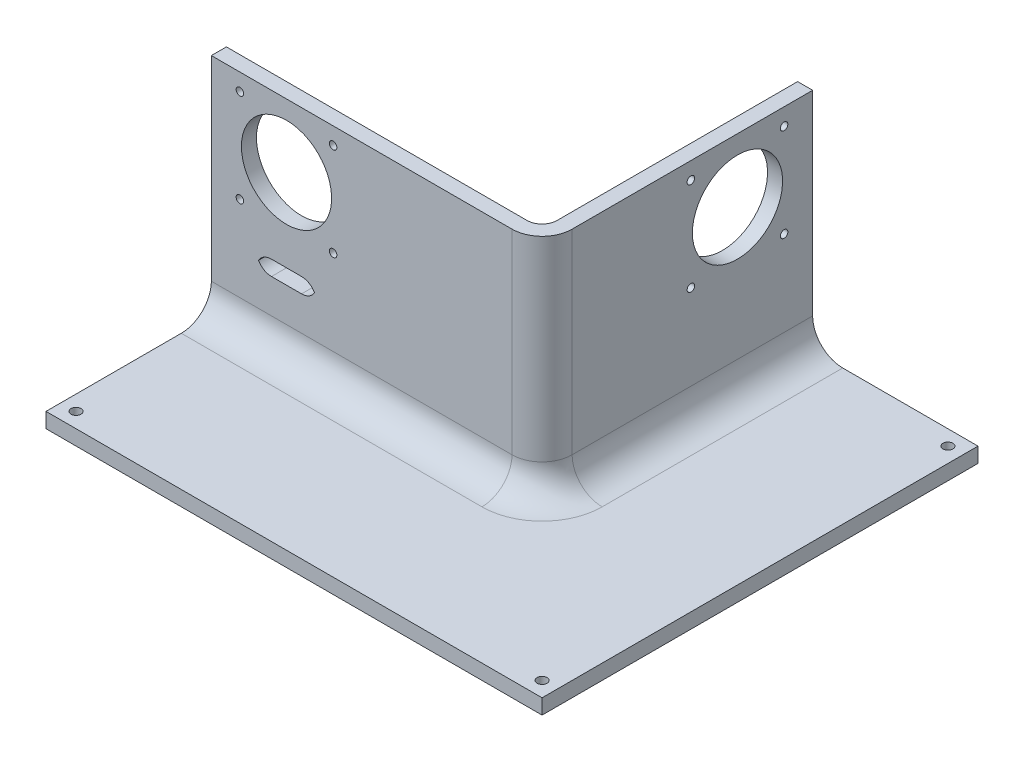
ISO-10303-21;
HEADER;
FILE_DESCRIPTION(('STEP AP214'),'2;1');
FILE_NAME('part.step','',(''),(''),'','','');
FILE_SCHEMA(('AUTOMOTIVE_DESIGN { 1 0 10303 214 1 1 1 1 }'));
ENDSEC;
DATA;
#1=APPLICATION_CONTEXT('core data for automotive mechanical design processes');
#2=APPLICATION_PROTOCOL_DEFINITION('international standard','automotive_design',2000,#1);
#3=PRODUCT_CONTEXT('',#1,'mechanical');
#4=PRODUCT('Part','Part','',(#3));
#5=PRODUCT_RELATED_PRODUCT_CATEGORY('part','',(#4));
#6=PRODUCT_DEFINITION_FORMATION('','',#4);
#7=PRODUCT_DEFINITION_CONTEXT('part definition',#1,'design');
#8=PRODUCT_DEFINITION('design','',#6,#7);
#9=PRODUCT_DEFINITION_SHAPE('','',#8);
#10=(LENGTH_UNIT() NAMED_UNIT(*) SI_UNIT(.MILLI.,.METRE.));
#11=(NAMED_UNIT(*) PLANE_ANGLE_UNIT() SI_UNIT($,.RADIAN.));
#12=(NAMED_UNIT(*) SI_UNIT($,.STERADIAN.) SOLID_ANGLE_UNIT());
#13=UNCERTAINTY_MEASURE_WITH_UNIT(LENGTH_MEASURE(1.E-05),#10,'distance_accuracy_value','');
#14=(GEOMETRIC_REPRESENTATION_CONTEXT(3) GLOBAL_UNCERTAINTY_ASSIGNED_CONTEXT((#13)) GLOBAL_UNIT_ASSIGNED_CONTEXT((#10,
#11,#12)) REPRESENTATION_CONTEXT('',''));
#15=CARTESIAN_POINT('',(0.,0.,0.));
#16=DIRECTION('',(0.,0.,1.));
#17=DIRECTION('',(1.,0.,0.));
#18=AXIS2_PLACEMENT_3D('',#15,#16,#17);
#19=CARTESIAN_POINT('',(0.,20.,-85.));
#20=DIRECTION('',(0.,0.,-1.));
#21=DIRECTION('',(-1.,0.,0.));
#22=AXIS2_PLACEMENT_3D('',#19,#20,#21);
#23=PLANE('',#22);
#24=DIRECTION('',(0.,1.,0.));
#25=VECTOR('',#24,1.);
#26=CARTESIAN_POINT('',(60.,-5.,-85.));
#27=LINE('',#26,#25);
#28=CARTESIAN_POINT('',(60.,0.,-85.));
#29=VERTEX_POINT('',#28);
#30=CARTESIAN_POINT('',(60.,5.,-85.));
#31=VERTEX_POINT('',#30);
#32=EDGE_CURVE('E76',#29,#31,#27,.T.);
#33=ORIENTED_EDGE('',*,*,#32,.F.);
#34=DIRECTION('',(1.,0.,0.));
#35=VECTOR('',#34,1.);
#36=CARTESIAN_POINT('',(0.,0.,-85.));
#37=LINE('',#36,#35);
#38=CARTESIAN_POINT('',(0.,0.,-85.));
#39=VERTEX_POINT('',#38);
#40=EDGE_CURVE('E280',#39,#29,#37,.T.);
#41=ORIENTED_EDGE('',*,*,#40,.F.);
#42=DIRECTION('',(0.,-1.,0.));
#43=VECTOR('',#42,1.);
#44=CARTESIAN_POINT('',(0.,20.,-85.));
#45=LINE('',#44,#43);
#46=CARTESIAN_POINT('',(0.,80.,-85.));
#47=VERTEX_POINT('',#46);
#48=EDGE_CURVE('E283',#47,#39,#45,.T.);
#49=ORIENTED_EDGE('',*,*,#48,.F.);
#50=DIRECTION('',(-1.,0.,0.));
#51=VECTOR('',#50,1.);
#52=CARTESIAN_POINT('',(0.,80.,-85.));
#53=LINE('',#52,#51);
#54=CARTESIAN_POINT('',(5.,80.,-85.));
#55=VERTEX_POINT('',#54);
#56=EDGE_CURVE('E263',#55,#47,#53,.T.);
#57=ORIENTED_EDGE('',*,*,#56,.F.);
#58=DIRECTION('',(0.,-1.,0.));
#59=VECTOR('',#58,1.);
#60=CARTESIAN_POINT('',(5.,80.,-85.));
#61=LINE('',#60,#59);
#62=CARTESIAN_POINT('',(5.,15.,-85.));
#63=VERTEX_POINT('',#62);
#64=EDGE_CURVE('E269',#55,#63,#61,.T.);
#65=ORIENTED_EDGE('',*,*,#64,.T.);
#66=CARTESIAN_POINT('',(15.,15.,-85.));
#67=DIRECTION('',(0.,0.,-1.));
#68=DIRECTION('',(-1.,0.,0.));
#69=AXIS2_PLACEMENT_3D('',#66,#67,#68);
#70=CIRCLE('',#69,10.);
#71=CARTESIAN_POINT('',(15.,5.,-85.));
#72=VERTEX_POINT('',#71);
#73=EDGE_CURVE('E336',#63,#72,#70,.F.);
#74=ORIENTED_EDGE('',*,*,#73,.T.);
#75=DIRECTION('',(-1.,0.,0.));
#76=VECTOR('',#75,1.);
#77=CARTESIAN_POINT('',(80.,5.,-85.));
#78=LINE('',#77,#76);
#79=EDGE_CURVE('E213',#31,#72,#78,.T.);
#80=ORIENTED_EDGE('',*,*,#79,.F.);
#81=EDGE_LOOP('',(#33,#41,#49,#57,#65,#74,#80));
#82=FACE_BOUND('',#81,.T.);
#83=ADVANCED_FACE('F59',(#82),#23,.T.);
#84=CARTESIAN_POINT('',(0.,0.,0.));
#85=DIRECTION('',(0.,1.,0.));
#86=DIRECTION('',(0.,0.,1.));
#87=AXIS2_PLACEMENT_3D('',#84,#85,#86);
#88=PLANE('',#87);
#89=CARTESIAN_POINT('',(55.,0.,-80.));
#90=DIRECTION('',(0.,1.,0.));
#91=DIRECTION('',(0.,0.,1.));
#92=AXIS2_PLACEMENT_3D('',#89,#90,#91);
#93=CIRCLE('',#92,1.65);
#94=CARTESIAN_POINT('',(55.,0.,-78.35));
#95=VERTEX_POINT('',#94);
#96=EDGE_CURVE('E232',#95,#95,#93,.T.);
#97=ORIENTED_EDGE('',*,*,#96,.T.);
#98=EDGE_LOOP('',(#97));
#99=FACE_BOUND('',#98,.T.);
#100=CARTESIAN_POINT('',(55.,0.,55.));
#101=DIRECTION('',(0.,1.,0.));
#102=DIRECTION('',(0.,0.,1.));
#103=AXIS2_PLACEMENT_3D('',#100,#101,#102);
#104=CIRCLE('',#103,1.65);
#105=CARTESIAN_POINT('',(55.,0.,56.65));
#106=VERTEX_POINT('',#105);
#107=EDGE_CURVE('E313',#106,#106,#104,.T.);
#108=ORIENTED_EDGE('',*,*,#107,.T.);
#109=EDGE_LOOP('',(#108));
#110=FACE_BOUND('',#109,.T.);
#111=CARTESIAN_POINT('',(-100.,0.,55.));
#112=DIRECTION('',(0.,1.,0.));
#113=DIRECTION('',(0.,0.,1.));
#114=AXIS2_PLACEMENT_3D('',#111,#112,#113);
#115=CIRCLE('',#114,1.65);
#116=CARTESIAN_POINT('',(-100.,0.,56.65));
#117=VERTEX_POINT('',#116);
#118=EDGE_CURVE('E228',#117,#117,#115,.T.);
#119=ORIENTED_EDGE('',*,*,#118,.T.);
#120=EDGE_LOOP('',(#119));
#121=FACE_BOUND('',#120,.T.);
#122=ORIENTED_EDGE('',*,*,#40,.T.);
#123=DIRECTION('',(0.,0.,1.));
#124=VECTOR('',#123,1.);
#125=CARTESIAN_POINT('',(60.,0.,0.));
#126=LINE('',#125,#124);
#127=CARTESIAN_POINT('',(60.,0.,60.));
#128=VERTEX_POINT('',#127);
#129=EDGE_CURVE('E204',#29,#128,#126,.T.);
#130=ORIENTED_EDGE('',*,*,#129,.T.);
#131=DIRECTION('',(-1.,0.,0.));
#132=VECTOR('',#131,1.);
#133=CARTESIAN_POINT('',(0.,0.,60.));
#134=LINE('',#133,#132);
#135=CARTESIAN_POINT('',(-105.,0.,60.));
#136=VERTEX_POINT('',#135);
#137=EDGE_CURVE('E203',#128,#136,#134,.T.);
#138=ORIENTED_EDGE('',*,*,#137,.T.);
#139=DIRECTION('',(0.,0.,-1.));
#140=VECTOR('',#139,1.);
#141=CARTESIAN_POINT('',(-105.,0.,0.));
#142=LINE('',#141,#140);
#143=CARTESIAN_POINT('',(-105.,0.,0.));
#144=VERTEX_POINT('',#143);
#145=EDGE_CURVE('E278',#136,#144,#142,.T.);
#146=ORIENTED_EDGE('',*,*,#145,.T.);
#147=DIRECTION('',(-1.,0.,0.));
#148=VECTOR('',#147,1.);
#149=CARTESIAN_POINT('',(0.,0.,0.));
#150=LINE('',#149,#148);
#151=CARTESIAN_POINT('',(-5.,0.,0.));
#152=VERTEX_POINT('',#151);
#153=EDGE_CURVE('E275',#152,#144,#150,.T.);
#154=ORIENTED_EDGE('',*,*,#153,.F.);
#155=CARTESIAN_POINT('',(-5.,0.,-5.));
#156=DIRECTION('',(0.,1.,0.));
#157=DIRECTION('',(0.,0.,1.));
#158=AXIS2_PLACEMENT_3D('',#155,#156,#157);
#159=CIRCLE('',#158,5.);
#160=CARTESIAN_POINT('',(0.,0.,-5.));
#161=VERTEX_POINT('',#160);
#162=EDGE_CURVE('E305',#152,#161,#159,.T.);
#163=ORIENTED_EDGE('',*,*,#162,.T.);
#164=DIRECTION('',(0.,0.,1.));
#165=VECTOR('',#164,1.);
#166=CARTESIAN_POINT('',(0.,0.,0.));
#167=LINE('',#166,#165);
#168=EDGE_CURVE('E272',#39,#161,#167,.T.);
#169=ORIENTED_EDGE('',*,*,#168,.F.);
#170=EDGE_LOOP('',(#122,#130,#138,#146,#154,#163,#169));
#171=FACE_BOUND('',#170,.T.);
#172=ADVANCED_FACE('F412',(#99,#110,#121,#171),#88,.F.);
#173=CARTESIAN_POINT('',(0.,20.,0.));
#174=DIRECTION('',(1.,0.,0.));
#175=DIRECTION('',(0.,0.,-1.));
#176=AXIS2_PLACEMENT_3D('',#173,#174,#175);
#177=PLANE('',#176);
#178=CARTESIAN_POINT('',(0.,74.35,-44.5));
#179=DIRECTION('',(-1.,0.,0.));
#180=DIRECTION('',(0.,0.,1.));
#181=AXIS2_PLACEMENT_3D('',#178,#179,#180);
#182=CIRCLE('',#181,1.25);
#183=CARTESIAN_POINT('',(0.,74.35,-43.25));
#184=VERTEX_POINT('',#183);
#185=EDGE_CURVE('E247',#184,#184,#182,.T.);
#186=ORIENTED_EDGE('',*,*,#185,.F.);
#187=EDGE_LOOP('',(#186));
#188=FACE_BOUND('',#187,.T.);
#189=CARTESIAN_POINT('',(0.,43.35,-75.5));
#190=DIRECTION('',(-1.,0.,0.));
#191=DIRECTION('',(0.,0.,1.));
#192=AXIS2_PLACEMENT_3D('',#189,#190,#191);
#193=CIRCLE('',#192,1.25);
#194=CARTESIAN_POINT('',(0.,43.35,-74.25));
#195=VERTEX_POINT('',#194);
#196=EDGE_CURVE('E246',#195,#195,#193,.T.);
#197=ORIENTED_EDGE('',*,*,#196,.F.);
#198=EDGE_LOOP('',(#197));
#199=FACE_BOUND('',#198,.T.);
#200=CARTESIAN_POINT('',(0.,43.35,-44.5));
#201=DIRECTION('',(-1.,0.,0.));
#202=DIRECTION('',(0.,0.,1.));
#203=AXIS2_PLACEMENT_3D('',#200,#201,#202);
#204=CIRCLE('',#203,1.25);
#205=CARTESIAN_POINT('',(0.,43.35,-43.25));
#206=VERTEX_POINT('',#205);
#207=EDGE_CURVE('E243',#206,#206,#204,.T.);
#208=ORIENTED_EDGE('',*,*,#207,.F.);
#209=EDGE_LOOP('',(#208));
#210=FACE_BOUND('',#209,.T.);
#211=CARTESIAN_POINT('',(0.,74.35,-75.5));
#212=DIRECTION('',(-1.,0.,0.));
#213=DIRECTION('',(0.,0.,1.));
#214=AXIS2_PLACEMENT_3D('',#211,#212,#213);
#215=CIRCLE('',#214,1.25);
#216=CARTESIAN_POINT('',(0.,74.35,-74.25));
#217=VERTEX_POINT('',#216);
#218=EDGE_CURVE('E250',#217,#217,#215,.T.);
#219=ORIENTED_EDGE('',*,*,#218,.F.);
#220=EDGE_LOOP('',(#219));
#221=FACE_BOUND('',#220,.T.);
#222=CARTESIAN_POINT('',(0.,58.85,-60.));
#223=DIRECTION('',(-1.,0.,0.));
#224=DIRECTION('',(0.,0.,1.));
#225=AXIS2_PLACEMENT_3D('',#222,#223,#224);
#226=CIRCLE('',#225,15.);
#227=CARTESIAN_POINT('',(0.,58.85,-45.));
#228=VERTEX_POINT('',#227);
#229=EDGE_CURVE('E256',#228,#228,#226,.T.);
#230=ORIENTED_EDGE('',*,*,#229,.F.);
#231=EDGE_LOOP('',(#230));
#232=FACE_BOUND('',#231,.T.);
#233=ORIENTED_EDGE('',*,*,#168,.T.);
#234=DIRECTION('',(0.,-1.,0.));
#235=VECTOR('',#234,1.);
#236=CARTESIAN_POINT('',(0.,80.,-5.));
#237=LINE('',#236,#235);
#238=CARTESIAN_POINT('',(0.,80.,-5.));
#239=VERTEX_POINT('',#238);
#240=EDGE_CURVE('E303',#161,#239,#237,.F.);
#241=ORIENTED_EDGE('',*,*,#240,.T.);
#242=DIRECTION('',(0.,0.,1.));
#243=VECTOR('',#242,1.);
#244=CARTESIAN_POINT('',(0.,80.,0.));
#245=LINE('',#244,#243);
#246=EDGE_CURVE('E266',#47,#239,#245,.T.);
#247=ORIENTED_EDGE('',*,*,#246,.F.);
#248=ORIENTED_EDGE('',*,*,#48,.T.);
#249=EDGE_LOOP('',(#233,#241,#247,#248));
#250=FACE_BOUND('',#249,.T.);
#251=ADVANCED_FACE('F418',(#188,#199,#210,#221,#232,#250),#177,.F.);
#252=CARTESIAN_POINT('',(0.,20.,0.));
#253=DIRECTION('',(0.,0.,1.));
#254=DIRECTION('',(1.,0.,0.));
#255=AXIS2_PLACEMENT_3D('',#252,#253,#254);
#256=PLANE('',#255);
#257=CARTESIAN_POINT('',(-95.5,43.35,0.));
#258=DIRECTION('',(0.,0.,-1.));
#259=DIRECTION('',(-1.,0.,0.));
#260=AXIS2_PLACEMENT_3D('',#257,#258,#259);
#261=CIRCLE('',#260,1.25);
#262=CARTESIAN_POINT('',(-96.75,43.35,0.));
#263=VERTEX_POINT('',#262);
#264=EDGE_CURVE('E495',#263,#263,#261,.T.);
#265=ORIENTED_EDGE('',*,*,#264,.F.);
#266=EDGE_LOOP('',(#265));
#267=FACE_BOUND('',#266,.T.);
#268=CARTESIAN_POINT('',(-64.5,43.35,0.));
#269=DIRECTION('',(0.,0.,-1.));
#270=DIRECTION('',(-1.,0.,0.));
#271=AXIS2_PLACEMENT_3D('',#268,#269,#270);
#272=CIRCLE('',#271,1.25);
#273=CARTESIAN_POINT('',(-65.75,43.35,0.));
#274=VERTEX_POINT('',#273);
#275=EDGE_CURVE('E497',#274,#274,#272,.T.);
#276=ORIENTED_EDGE('',*,*,#275,.F.);
#277=EDGE_LOOP('',(#276));
#278=FACE_BOUND('',#277,.T.);
#279=CARTESIAN_POINT('',(-64.5,74.35,0.));
#280=DIRECTION('',(0.,0.,-1.));
#281=DIRECTION('',(-1.,0.,0.));
#282=AXIS2_PLACEMENT_3D('',#279,#280,#281);
#283=CIRCLE('',#282,1.25);
#284=CARTESIAN_POINT('',(-65.75,74.35,0.));
#285=VERTEX_POINT('',#284);
#286=EDGE_CURVE('E500',#285,#285,#283,.T.);
#287=ORIENTED_EDGE('',*,*,#286,.F.);
#288=EDGE_LOOP('',(#287));
#289=FACE_BOUND('',#288,.T.);
#290=CARTESIAN_POINT('',(-95.5,74.35,0.));
#291=DIRECTION('',(0.,0.,-1.));
#292=DIRECTION('',(-1.,0.,0.));
#293=AXIS2_PLACEMENT_3D('',#290,#291,#292);
#294=CIRCLE('',#293,1.25);
#295=CARTESIAN_POINT('',(-96.75,74.35,0.));
#296=VERTEX_POINT('',#295);
#297=EDGE_CURVE('E494',#296,#296,#294,.T.);
#298=ORIENTED_EDGE('',*,*,#297,.F.);
#299=EDGE_LOOP('',(#298));
#300=FACE_BOUND('',#299,.T.);
#301=CARTESIAN_POINT('',(-80.,58.85,0.));
#302=DIRECTION('',(0.,0.,-1.));
#303=DIRECTION('',(-1.,0.,0.));
#304=AXIS2_PLACEMENT_3D('',#301,#302,#303);
#305=CIRCLE('',#304,15.);
#306=CARTESIAN_POINT('',(-95.,58.85,0.));
#307=VERTEX_POINT('',#306);
#308=EDGE_CURVE('E382',#307,#307,#305,.T.);
#309=ORIENTED_EDGE('',*,*,#308,.F.);
#310=EDGE_LOOP('',(#309));
#311=FACE_BOUND('',#310,.T.);
#312=DIRECTION('',(-1.,0.,0.));
#313=VECTOR('',#312,1.);
#314=CARTESIAN_POINT('',(0.,31.35,0.));
#315=LINE('',#314,#313);
#316=CARTESIAN_POINT('',(-75.,31.35,0.));
#317=VERTEX_POINT('',#316);
#318=CARTESIAN_POINT('',(-85.,31.35,0.));
#319=VERTEX_POINT('',#318);
#320=EDGE_CURVE('E480',#317,#319,#315,.T.);
#321=ORIENTED_EDGE('',*,*,#320,.T.);
#322=CARTESIAN_POINT('',(-85.,26.35,0.));
#323=DIRECTION('',(0.,0.,1.));
#324=DIRECTION('',(1.,0.,0.));
#325=AXIS2_PLACEMENT_3D('',#322,#323,#324);
#326=CIRCLE('',#325,5.);
#327=CARTESIAN_POINT('',(-89.3301270189222,28.85,0.));
#328=VERTEX_POINT('',#327);
#329=EDGE_CURVE('E364',#319,#328,#326,.T.);
#330=ORIENTED_EDGE('',*,*,#329,.T.);
#331=CARTESIAN_POINT('',(-85.,31.35,0.));
#332=DIRECTION('',(0.,0.,1.));
#333=DIRECTION('',(1.,0.,0.));
#334=AXIS2_PLACEMENT_3D('',#331,#332,#333);
#335=CIRCLE('',#334,5.);
#336=CARTESIAN_POINT('',(-85.,26.35,0.));
#337=VERTEX_POINT('',#336);
#338=EDGE_CURVE('E360',#328,#337,#335,.T.);
#339=ORIENTED_EDGE('',*,*,#338,.T.);
#340=DIRECTION('',(1.,0.,0.));
#341=VECTOR('',#340,1.);
#342=CARTESIAN_POINT('',(0.,26.35,0.));
#343=LINE('',#342,#341);
#344=CARTESIAN_POINT('',(-75.,26.35,0.));
#345=VERTEX_POINT('',#344);
#346=EDGE_CURVE('E344',#337,#345,#343,.T.);
#347=ORIENTED_EDGE('',*,*,#346,.T.);
#348=CARTESIAN_POINT('',(-75.,31.35,0.));
#349=DIRECTION('',(0.,0.,1.));
#350=DIRECTION('',(1.,0.,0.));
#351=AXIS2_PLACEMENT_3D('',#348,#349,#350);
#352=CIRCLE('',#351,5.);
#353=CARTESIAN_POINT('',(-70.6698729810778,28.85,0.));
#354=VERTEX_POINT('',#353);
#355=EDGE_CURVE('E12',#345,#354,#352,.T.);
#356=ORIENTED_EDGE('',*,*,#355,.T.);
#357=CARTESIAN_POINT('',(-75.,26.35,0.));
#358=DIRECTION('',(0.,0.,1.));
#359=DIRECTION('',(1.,0.,0.));
#360=AXIS2_PLACEMENT_3D('',#357,#358,#359);
#361=CIRCLE('',#360,5.);
#362=EDGE_CURVE('E368',#354,#317,#361,.T.);
#363=ORIENTED_EDGE('',*,*,#362,.T.);
#364=EDGE_LOOP('',(#321,#330,#339,#347,#356,#363));
#365=FACE_BOUND('',#364,.T.);
#366=DIRECTION('',(-1.,0.,0.));
#367=VECTOR('',#366,1.);
#368=CARTESIAN_POINT('',(-105.,80.,0.));
#369=LINE('',#368,#367);
#370=CARTESIAN_POINT('',(-5.,80.,0.));
#371=VERTEX_POINT('',#370);
#372=CARTESIAN_POINT('',(-105.,80.,0.));
#373=VERTEX_POINT('',#372);
#374=EDGE_CURVE('E238',#371,#373,#369,.T.);
#375=ORIENTED_EDGE('',*,*,#374,.F.);
#376=DIRECTION('',(0.,-1.,0.));
#377=VECTOR('',#376,1.);
#378=CARTESIAN_POINT('',(-5.,0.,0.));
#379=LINE('',#378,#377);
#380=EDGE_CURVE('E288',#371,#152,#379,.T.);
#381=ORIENTED_EDGE('',*,*,#380,.T.);
#382=ORIENTED_EDGE('',*,*,#153,.T.);
#383=DIRECTION('',(0.,-1.,0.));
#384=VECTOR('',#383,1.);
#385=CARTESIAN_POINT('',(-105.,20.,0.));
#386=LINE('',#385,#384);
#387=EDGE_CURVE('E285',#373,#144,#386,.T.);
#388=ORIENTED_EDGE('',*,*,#387,.F.);
#389=EDGE_LOOP('',(#375,#381,#382,#388));
#390=FACE_BOUND('',#389,.T.);
#391=ADVANCED_FACE('F427',(#267,#278,#289,#300,#311,#365,#390),#256,.F.);
#392=CARTESIAN_POINT('',(-105.,20.,0.));
#393=DIRECTION('',(-1.,0.,0.));
#394=DIRECTION('',(0.,0.,1.));
#395=AXIS2_PLACEMENT_3D('',#392,#393,#394);
#396=PLANE('',#395);
#397=DIRECTION('',(0.,0.,1.));
#398=VECTOR('',#397,1.);
#399=CARTESIAN_POINT('',(-105.,5.,5.00000000000003));
#400=LINE('',#399,#398);
#401=CARTESIAN_POINT('',(-105.,5.,15.));
#402=VERTEX_POINT('',#401);
#403=CARTESIAN_POINT('',(-105.,5.,60.));
#404=VERTEX_POINT('',#403);
#405=EDGE_CURVE('E210',#402,#404,#400,.T.);
#406=ORIENTED_EDGE('',*,*,#405,.F.);
#407=CARTESIAN_POINT('',(-105.,15.,15.));
#408=DIRECTION('',(-1.,0.,0.));
#409=DIRECTION('',(0.,0.,1.));
#410=AXIS2_PLACEMENT_3D('',#407,#408,#409);
#411=CIRCLE('',#410,10.);
#412=CARTESIAN_POINT('',(-105.,15.,5.00000000000001));
#413=VERTEX_POINT('',#412);
#414=EDGE_CURVE('E334',#402,#413,#411,.F.);
#415=ORIENTED_EDGE('',*,*,#414,.T.);
#416=DIRECTION('',(0.,-1.,0.));
#417=VECTOR('',#416,1.);
#418=CARTESIAN_POINT('',(-105.,80.,5.00000000000001));
#419=LINE('',#418,#417);
#420=CARTESIAN_POINT('',(-105.,80.,5.00000000000001));
#421=VERTEX_POINT('',#420);
#422=EDGE_CURVE('E240',#421,#413,#419,.T.);
#423=ORIENTED_EDGE('',*,*,#422,.F.);
#424=DIRECTION('',(0.,0.,1.));
#425=VECTOR('',#424,1.);
#426=CARTESIAN_POINT('',(-105.,80.,0.));
#427=LINE('',#426,#425);
#428=EDGE_CURVE('E231',#373,#421,#427,.T.);
#429=ORIENTED_EDGE('',*,*,#428,.F.);
#430=ORIENTED_EDGE('',*,*,#387,.T.);
#431=ORIENTED_EDGE('',*,*,#145,.F.);
#432=DIRECTION('',(0.,1.,0.));
#433=VECTOR('',#432,1.);
#434=CARTESIAN_POINT('',(-105.,-80.,60.));
#435=LINE('',#434,#433);
#436=EDGE_CURVE('E229',#136,#404,#435,.T.);
#437=ORIENTED_EDGE('',*,*,#436,.T.);
#438=EDGE_LOOP('',(#406,#415,#423,#429,#430,#431,#437));
#439=FACE_BOUND('',#438,.T.);
#440=ADVANCED_FACE('F423',(#439),#396,.T.);
#441=CARTESIAN_POINT('',(5.,80.,0.));
#442=DIRECTION('',(-1.,0.,0.));
#443=DIRECTION('',(0.,0.,1.));
#444=AXIS2_PLACEMENT_3D('',#441,#442,#443);
#445=PLANE('',#444);
#446=CARTESIAN_POINT('',(5.,74.35,-44.5));
#447=DIRECTION('',(-1.,0.,0.));
#448=DIRECTION('',(0.,0.,1.));
#449=AXIS2_PLACEMENT_3D('',#446,#447,#448);
#450=CIRCLE('',#449,1.25);
#451=CARTESIAN_POINT('',(5.,74.35,-43.25));
#452=VERTEX_POINT('',#451);
#453=EDGE_CURVE('E260',#452,#452,#450,.T.);
#454=ORIENTED_EDGE('',*,*,#453,.T.);
#455=EDGE_LOOP('',(#454));
#456=FACE_BOUND('',#455,.T.);
#457=CARTESIAN_POINT('',(5.,43.35,-75.5));
#458=DIRECTION('',(-1.,0.,0.));
#459=DIRECTION('',(0.,0.,1.));
#460=AXIS2_PLACEMENT_3D('',#457,#458,#459);
#461=CIRCLE('',#460,1.25);
#462=CARTESIAN_POINT('',(5.,43.35,-74.25));
#463=VERTEX_POINT('',#462);
#464=EDGE_CURVE('E296',#463,#463,#461,.T.);
#465=ORIENTED_EDGE('',*,*,#464,.T.);
#466=EDGE_LOOP('',(#465));
#467=FACE_BOUND('',#466,.T.);
#468=CARTESIAN_POINT('',(5.,43.35,-44.5));
#469=DIRECTION('',(-1.,0.,0.));
#470=DIRECTION('',(0.,0.,1.));
#471=AXIS2_PLACEMENT_3D('',#468,#469,#470);
#472=CIRCLE('',#471,1.25);
#473=CARTESIAN_POINT('',(5.,43.35,-43.25));
#474=VERTEX_POINT('',#473);
#475=EDGE_CURVE('E293',#474,#474,#472,.T.);
#476=ORIENTED_EDGE('',*,*,#475,.T.);
#477=EDGE_LOOP('',(#476));
#478=FACE_BOUND('',#477,.T.);
#479=CARTESIAN_POINT('',(5.,74.35,-75.5));
#480=DIRECTION('',(-1.,0.,0.));
#481=DIRECTION('',(0.,0.,1.));
#482=AXIS2_PLACEMENT_3D('',#479,#480,#481);
#483=CIRCLE('',#482,1.25);
#484=CARTESIAN_POINT('',(5.,74.35,-74.25));
#485=VERTEX_POINT('',#484);
#486=EDGE_CURVE('E255',#485,#485,#483,.T.);
#487=ORIENTED_EDGE('',*,*,#486,.T.);
#488=EDGE_LOOP('',(#487));
#489=FACE_BOUND('',#488,.T.);
#490=CARTESIAN_POINT('',(5.,58.85,-60.));
#491=DIRECTION('',(-1.,0.,0.));
#492=DIRECTION('',(0.,0.,1.));
#493=AXIS2_PLACEMENT_3D('',#490,#491,#492);
#494=CIRCLE('',#493,15.);
#495=CARTESIAN_POINT('',(5.,58.85,-45.));
#496=VERTEX_POINT('',#495);
#497=EDGE_CURVE('E259',#496,#496,#494,.T.);
#498=ORIENTED_EDGE('',*,*,#497,.T.);
#499=EDGE_LOOP('',(#498));
#500=FACE_BOUND('',#499,.T.);
#501=DIRECTION('',(0.,-1.,0.));
#502=VECTOR('',#501,1.);
#503=CARTESIAN_POINT('',(5.,80.,-4.99999999999999));
#504=LINE('',#503,#502);
#505=CARTESIAN_POINT('',(5.,80.,-4.99999999999999));
#506=VERTEX_POINT('',#505);
#507=CARTESIAN_POINT('',(5.,15.,-4.99999999999999));
#508=VERTEX_POINT('',#507);
#509=EDGE_CURVE('E328',#506,#508,#504,.T.);
#510=ORIENTED_EDGE('',*,*,#509,.T.);
#511=DIRECTION('',(0.,0.,-1.));
#512=VECTOR('',#511,1.);
#513=CARTESIAN_POINT('',(5.,15.,-85.));
#514=LINE('',#513,#512);
#515=EDGE_CURVE('E330',#508,#63,#514,.T.);
#516=ORIENTED_EDGE('',*,*,#515,.T.);
#517=ORIENTED_EDGE('',*,*,#64,.F.);
#518=DIRECTION('',(0.,0.,-1.));
#519=VECTOR('',#518,1.);
#520=CARTESIAN_POINT('',(5.,80.,0.));
#521=LINE('',#520,#519);
#522=EDGE_CURVE('E261',#506,#55,#521,.T.);
#523=ORIENTED_EDGE('',*,*,#522,.F.);
#524=EDGE_LOOP('',(#510,#516,#517,#523));
#525=FACE_BOUND('',#524,.T.);
#526=ADVANCED_FACE('F426',(#456,#467,#478,#489,#500,#525),#445,.F.);
#527=CARTESIAN_POINT('',(0.,80.,0.));
#528=DIRECTION('',(0.,-1.,0.));
#529=DIRECTION('',(0.,0.,-1.));
#530=AXIS2_PLACEMENT_3D('',#527,#528,#529);
#531=PLANE('',#530);
#532=DIRECTION('',(1.,0.,0.));
#533=VECTOR('',#532,1.);
#534=CARTESIAN_POINT('',(-105.,80.,5.00000000000001));
#535=LINE('',#534,#533);
#536=CARTESIAN_POINT('',(-5.,80.,5.00000000000001));
#537=VERTEX_POINT('',#536);
#538=EDGE_CURVE('E235',#421,#537,#535,.T.);
#539=ORIENTED_EDGE('',*,*,#538,.T.);
#540=CARTESIAN_POINT('',(-5.,80.,-4.99999999999999));
#541=DIRECTION('',(0.,-1.,0.));
#542=DIRECTION('',(0.,0.,-1.));
#543=AXIS2_PLACEMENT_3D('',#540,#541,#542);
#544=CIRCLE('',#543,10.);
#545=EDGE_CURVE('E332',#537,#506,#544,.F.);
#546=ORIENTED_EDGE('',*,*,#545,.T.);
#547=ORIENTED_EDGE('',*,*,#522,.T.);
#548=ORIENTED_EDGE('',*,*,#56,.T.);
#549=ORIENTED_EDGE('',*,*,#246,.T.);
#550=CARTESIAN_POINT('',(-5.,80.,-5.));
#551=DIRECTION('',(0.,-1.,0.));
#552=DIRECTION('',(0.,0.,-1.));
#553=AXIS2_PLACEMENT_3D('',#550,#551,#552);
#554=CIRCLE('',#553,5.);
#555=EDGE_CURVE('E307',#239,#371,#554,.T.);
#556=ORIENTED_EDGE('',*,*,#555,.T.);
#557=ORIENTED_EDGE('',*,*,#374,.T.);
#558=ORIENTED_EDGE('',*,*,#428,.T.);
#559=EDGE_LOOP('',(#539,#546,#547,#548,#549,#556,#557,#558));
#560=FACE_BOUND('',#559,.T.);
#561=ADVANCED_FACE('F531',(#560),#531,.F.);
#562=CARTESIAN_POINT('',(100.,58.85,-60.));
#563=DIRECTION('',(-1.,0.,0.));
#564=DIRECTION('',(0.,0.,1.));
#565=AXIS2_PLACEMENT_3D('',#562,#563,#564);
#566=CYLINDRICAL_SURFACE('',#565,15.);
#567=ORIENTED_EDGE('',*,*,#229,.T.);
#568=EDGE_LOOP('',(#567));
#569=FACE_BOUND('',#568,.T.);
#570=ORIENTED_EDGE('',*,*,#497,.F.);
#571=EDGE_LOOP('',(#570));
#572=FACE_BOUND('',#571,.T.);
#573=ADVANCED_FACE('F560',(#569,#572),#566,.F.);
#574=CARTESIAN_POINT('',(100.,74.35,-75.5));
#575=DIRECTION('',(-1.,0.,0.));
#576=DIRECTION('',(0.,0.,1.));
#577=AXIS2_PLACEMENT_3D('',#574,#575,#576);
#578=CYLINDRICAL_SURFACE('',#577,1.25);
#579=ORIENTED_EDGE('',*,*,#218,.T.);
#580=EDGE_LOOP('',(#579));
#581=FACE_BOUND('',#580,.T.);
#582=ORIENTED_EDGE('',*,*,#486,.F.);
#583=EDGE_LOOP('',(#582));
#584=FACE_BOUND('',#583,.T.);
#585=ADVANCED_FACE('F552',(#581,#584),#578,.F.);
#586=CARTESIAN_POINT('',(100.,43.35,-44.5));
#587=DIRECTION('',(-1.,0.,0.));
#588=DIRECTION('',(0.,0.,1.));
#589=AXIS2_PLACEMENT_3D('',#586,#587,#588);
#590=CYLINDRICAL_SURFACE('',#589,1.25);
#591=ORIENTED_EDGE('',*,*,#207,.T.);
#592=EDGE_LOOP('',(#591));
#593=FACE_BOUND('',#592,.T.);
#594=ORIENTED_EDGE('',*,*,#475,.F.);
#595=EDGE_LOOP('',(#594));
#596=FACE_BOUND('',#595,.T.);
#597=ADVANCED_FACE('F550',(#593,#596),#590,.F.);
#598=CARTESIAN_POINT('',(100.,43.35,-75.5));
#599=DIRECTION('',(-1.,0.,0.));
#600=DIRECTION('',(0.,0.,1.));
#601=AXIS2_PLACEMENT_3D('',#598,#599,#600);
#602=CYLINDRICAL_SURFACE('',#601,1.25);
#603=ORIENTED_EDGE('',*,*,#196,.T.);
#604=EDGE_LOOP('',(#603));
#605=FACE_BOUND('',#604,.T.);
#606=ORIENTED_EDGE('',*,*,#464,.F.);
#607=EDGE_LOOP('',(#606));
#608=FACE_BOUND('',#607,.T.);
#609=ADVANCED_FACE('F544',(#605,#608),#602,.F.);
#610=CARTESIAN_POINT('',(100.,74.35,-44.5));
#611=DIRECTION('',(-1.,0.,0.));
#612=DIRECTION('',(0.,0.,1.));
#613=AXIS2_PLACEMENT_3D('',#610,#611,#612);
#614=CYLINDRICAL_SURFACE('',#613,1.25);
#615=ORIENTED_EDGE('',*,*,#185,.T.);
#616=EDGE_LOOP('',(#615));
#617=FACE_BOUND('',#616,.T.);
#618=ORIENTED_EDGE('',*,*,#453,.F.);
#619=EDGE_LOOP('',(#618));
#620=FACE_BOUND('',#619,.T.);
#621=ADVANCED_FACE('F539',(#617,#620),#614,.F.);
#622=CARTESIAN_POINT('',(-105.,80.,5.00000000000001));
#623=DIRECTION('',(0.,0.,-1.));
#624=DIRECTION('',(-1.,0.,0.));
#625=AXIS2_PLACEMENT_3D('',#622,#623,#624);
#626=PLANE('',#625);
#627=CARTESIAN_POINT('',(-95.5,43.35,5.00000000000001));
#628=DIRECTION('',(0.,0.,-1.));
#629=DIRECTION('',(-1.,0.,0.));
#630=AXIS2_PLACEMENT_3D('',#627,#628,#629);
#631=CIRCLE('',#630,1.25);
#632=CARTESIAN_POINT('',(-96.75,43.35,5.00000000000001));
#633=VERTEX_POINT('',#632);
#634=EDGE_CURVE('E63',#633,#633,#631,.T.);
#635=ORIENTED_EDGE('',*,*,#634,.T.);
#636=EDGE_LOOP('',(#635));
#637=FACE_BOUND('',#636,.T.);
#638=CARTESIAN_POINT('',(-64.5,43.35,5.00000000000001));
#639=DIRECTION('',(0.,0.,-1.));
#640=DIRECTION('',(-1.,0.,0.));
#641=AXIS2_PLACEMENT_3D('',#638,#639,#640);
#642=CIRCLE('',#641,1.25);
#643=CARTESIAN_POINT('',(-65.75,43.35,5.00000000000001));
#644=VERTEX_POINT('',#643);
#645=EDGE_CURVE('E387',#644,#644,#642,.T.);
#646=ORIENTED_EDGE('',*,*,#645,.T.);
#647=EDGE_LOOP('',(#646));
#648=FACE_BOUND('',#647,.T.);
#649=CARTESIAN_POINT('',(-64.5,74.35,5.00000000000001));
#650=DIRECTION('',(0.,0.,-1.));
#651=DIRECTION('',(-1.,0.,0.));
#652=AXIS2_PLACEMENT_3D('',#649,#650,#651);
#653=CIRCLE('',#652,1.25);
#654=CARTESIAN_POINT('',(-65.75,74.35,5.00000000000001));
#655=VERTEX_POINT('',#654);
#656=EDGE_CURVE('E385',#655,#655,#653,.T.);
#657=ORIENTED_EDGE('',*,*,#656,.T.);
#658=EDGE_LOOP('',(#657));
#659=FACE_BOUND('',#658,.T.);
#660=CARTESIAN_POINT('',(-95.5,74.35,5.00000000000001));
#661=DIRECTION('',(0.,0.,-1.));
#662=DIRECTION('',(-1.,0.,0.));
#663=AXIS2_PLACEMENT_3D('',#660,#661,#662);
#664=CIRCLE('',#663,1.25);
#665=CARTESIAN_POINT('',(-96.75,74.35,5.00000000000001));
#666=VERTEX_POINT('',#665);
#667=EDGE_CURVE('E381',#666,#666,#664,.T.);
#668=ORIENTED_EDGE('',*,*,#667,.T.);
#669=EDGE_LOOP('',(#668));
#670=FACE_BOUND('',#669,.T.);
#671=CARTESIAN_POINT('',(-80.,58.85,5.00000000000001));
#672=DIRECTION('',(0.,0.,-1.));
#673=DIRECTION('',(-1.,0.,0.));
#674=AXIS2_PLACEMENT_3D('',#671,#672,#673);
#675=CIRCLE('',#674,15.);
#676=CARTESIAN_POINT('',(-95.,58.85,5.00000000000001));
#677=VERTEX_POINT('',#676);
#678=EDGE_CURVE('E378',#677,#677,#675,.T.);
#679=ORIENTED_EDGE('',*,*,#678,.T.);
#680=EDGE_LOOP('',(#679));
#681=FACE_BOUND('',#680,.T.);
#682=CARTESIAN_POINT('',(-75.,26.35,5.00000000000001));
#683=DIRECTION('',(0.,0.,-1.));
#684=DIRECTION('',(-1.,0.,0.));
#685=AXIS2_PLACEMENT_3D('',#682,#683,#684);
#686=CIRCLE('',#685,5.);
#687=CARTESIAN_POINT('',(-75.,31.35,5.00000000000001));
#688=VERTEX_POINT('',#687);
#689=CARTESIAN_POINT('',(-70.6698729810778,28.85,5.00000000000001));
#690=VERTEX_POINT('',#689);
#691=EDGE_CURVE('E366',#688,#690,#686,.T.);
#692=ORIENTED_EDGE('',*,*,#691,.T.);
#693=CARTESIAN_POINT('',(-75.,31.35,5.00000000000001));
#694=DIRECTION('',(0.,0.,-1.));
#695=DIRECTION('',(-1.,0.,0.));
#696=AXIS2_PLACEMENT_3D('',#693,#694,#695);
#697=CIRCLE('',#696,5.);
#698=CARTESIAN_POINT('',(-75.,26.35,5.00000000000001));
#699=VERTEX_POINT('',#698);
#700=EDGE_CURVE('E68',#690,#699,#697,.T.);
#701=ORIENTED_EDGE('',*,*,#700,.T.);
#702=DIRECTION('',(1.,0.,0.));
#703=VECTOR('',#702,1.);
#704=CARTESIAN_POINT('',(-90.,26.35,5.00000000000001));
#705=LINE('',#704,#703);
#706=CARTESIAN_POINT('',(-85.,26.35,5.00000000000001));
#707=VERTEX_POINT('',#706);
#708=EDGE_CURVE('E486',#707,#699,#705,.T.);
#709=ORIENTED_EDGE('',*,*,#708,.F.);
#710=CARTESIAN_POINT('',(-85.,31.35,5.00000000000001));
#711=DIRECTION('',(0.,0.,-1.));
#712=DIRECTION('',(-1.,0.,0.));
#713=AXIS2_PLACEMENT_3D('',#710,#711,#712);
#714=CIRCLE('',#713,5.);
#715=CARTESIAN_POINT('',(-89.3301270189222,28.85,5.00000000000001));
#716=VERTEX_POINT('',#715);
#717=EDGE_CURVE('E358',#707,#716,#714,.T.);
#718=ORIENTED_EDGE('',*,*,#717,.T.);
#719=CARTESIAN_POINT('',(-85.,26.35,5.00000000000001));
#720=DIRECTION('',(0.,0.,-1.));
#721=DIRECTION('',(-1.,0.,0.));
#722=AXIS2_PLACEMENT_3D('',#719,#720,#721);
#723=CIRCLE('',#722,5.);
#724=CARTESIAN_POINT('',(-85.,31.35,5.00000000000001));
#725=VERTEX_POINT('',#724);
#726=EDGE_CURVE('E362',#716,#725,#723,.T.);
#727=ORIENTED_EDGE('',*,*,#726,.T.);
#728=DIRECTION('',(-1.,0.,0.));
#729=VECTOR('',#728,1.);
#730=CARTESIAN_POINT('',(-90.,31.35,5.00000000000001));
#731=LINE('',#730,#729);
#732=EDGE_CURVE('E374',#688,#725,#731,.T.);
#733=ORIENTED_EDGE('',*,*,#732,.F.);
#734=EDGE_LOOP('',(#692,#701,#709,#718,#727,#733));
#735=FACE_BOUND('',#734,.T.);
#736=ORIENTED_EDGE('',*,*,#422,.T.);
#737=DIRECTION('',(-1.,0.,0.));
#738=VECTOR('',#737,1.);
#739=CARTESIAN_POINT('',(5.,15.,5.00000000000001));
#740=LINE('',#739,#738);
#741=CARTESIAN_POINT('',(-5.,15.,5.00000000000001));
#742=VERTEX_POINT('',#741);
#743=EDGE_CURVE('E326',#413,#742,#740,.F.);
#744=ORIENTED_EDGE('',*,*,#743,.T.);
#745=DIRECTION('',(0.,-1.,0.));
#746=VECTOR('',#745,1.);
#747=CARTESIAN_POINT('',(-5.,80.,5.00000000000001));
#748=LINE('',#747,#746);
#749=EDGE_CURVE('E324',#742,#537,#748,.F.);
#750=ORIENTED_EDGE('',*,*,#749,.T.);
#751=ORIENTED_EDGE('',*,*,#538,.F.);
#752=EDGE_LOOP('',(#736,#744,#750,#751));
#753=FACE_BOUND('',#752,.T.);
#754=ADVANCED_FACE('F394',(#637,#648,#659,#670,#681,#735,#753),#626,.F.);
#755=CARTESIAN_POINT('',(-5.,20.,-5.));
#756=DIRECTION('',(0.,1.,0.));
#757=DIRECTION('',(0.,0.,1.));
#758=AXIS2_PLACEMENT_3D('',#755,#756,#757);
#759=CYLINDRICAL_SURFACE('',#758,5.);
#760=ORIENTED_EDGE('',*,*,#555,.F.);
#761=ORIENTED_EDGE('',*,*,#240,.F.);
#762=ORIENTED_EDGE('',*,*,#162,.F.);
#763=ORIENTED_EDGE('',*,*,#380,.F.);
#764=EDGE_LOOP('',(#760,#761,#762,#763));
#765=FACE_BOUND('',#764,.T.);
#766=ADVANCED_FACE('F435',(#765),#759,.F.);
#767=CARTESIAN_POINT('',(0.,-80.,60.));
#768=DIRECTION('',(0.,0.,-1.));
#769=DIRECTION('',(-1.,0.,0.));
#770=AXIS2_PLACEMENT_3D('',#767,#768,#769);
#771=PLANE('',#770);
#772=ORIENTED_EDGE('',*,*,#137,.F.);
#773=DIRECTION('',(0.,1.,0.));
#774=VECTOR('',#773,1.);
#775=CARTESIAN_POINT('',(60.,-5.,60.));
#776=LINE('',#775,#774);
#777=CARTESIAN_POINT('',(60.,5.,60.));
#778=VERTEX_POINT('',#777);
#779=EDGE_CURVE('E191',#128,#778,#776,.T.);
#780=ORIENTED_EDGE('',*,*,#779,.T.);
#781=DIRECTION('',(-1.,0.,0.));
#782=VECTOR('',#781,1.);
#783=CARTESIAN_POINT('',(80.,5.,60.));
#784=LINE('',#783,#782);
#785=EDGE_CURVE('E201',#778,#404,#784,.T.);
#786=ORIENTED_EDGE('',*,*,#785,.T.);
#787=ORIENTED_EDGE('',*,*,#436,.F.);
#788=EDGE_LOOP('',(#772,#780,#786,#787));
#789=FACE_BOUND('',#788,.T.);
#790=ADVANCED_FACE('F199',(#789),#771,.F.);
#791=CARTESIAN_POINT('',(-100.,-80.,55.));
#792=DIRECTION('',(0.,1.,0.));
#793=DIRECTION('',(0.,0.,1.));
#794=AXIS2_PLACEMENT_3D('',#791,#792,#793);
#795=CYLINDRICAL_SURFACE('',#794,1.65);
#796=CARTESIAN_POINT('',(-100.,5.,55.));
#797=DIRECTION('',(0.,-1.,0.));
#798=DIRECTION('',(0.,0.,-1.));
#799=AXIS2_PLACEMENT_3D('',#796,#797,#798);
#800=CIRCLE('',#799,1.65);
#801=CARTESIAN_POINT('',(-100.,5.,53.35));
#802=VERTEX_POINT('',#801);
#803=EDGE_CURVE('E225',#802,#802,#800,.F.);
#804=ORIENTED_EDGE('',*,*,#803,.T.);
#805=EDGE_LOOP('',(#804));
#806=FACE_BOUND('',#805,.T.);
#807=ORIENTED_EDGE('',*,*,#118,.F.);
#808=EDGE_LOOP('',(#807));
#809=FACE_BOUND('',#808,.T.);
#810=ADVANCED_FACE('F635',(#806,#809),#795,.F.);
#811=CARTESIAN_POINT('',(55.,-80.,55.));
#812=DIRECTION('',(0.,1.,0.));
#813=DIRECTION('',(0.,0.,1.));
#814=AXIS2_PLACEMENT_3D('',#811,#812,#813);
#815=CYLINDRICAL_SURFACE('',#814,1.65);
#816=CARTESIAN_POINT('',(55.,5.,55.));
#817=DIRECTION('',(0.,-1.,0.));
#818=DIRECTION('',(0.,0.,-1.));
#819=AXIS2_PLACEMENT_3D('',#816,#817,#818);
#820=CIRCLE('',#819,1.65);
#821=CARTESIAN_POINT('',(55.,5.,53.35));
#822=VERTEX_POINT('',#821);
#823=EDGE_CURVE('E216',#822,#822,#820,.F.);
#824=ORIENTED_EDGE('',*,*,#823,.T.);
#825=EDGE_LOOP('',(#824));
#826=FACE_BOUND('',#825,.T.);
#827=ORIENTED_EDGE('',*,*,#107,.F.);
#828=EDGE_LOOP('',(#827));
#829=FACE_BOUND('',#828,.T.);
#830=ADVANCED_FACE('F640',(#826,#829),#815,.F.);
#831=CARTESIAN_POINT('',(55.,-80.,-80.));
#832=DIRECTION('',(0.,1.,0.));
#833=DIRECTION('',(0.,0.,1.));
#834=AXIS2_PLACEMENT_3D('',#831,#832,#833);
#835=CYLINDRICAL_SURFACE('',#834,1.65);
#836=CARTESIAN_POINT('',(55.,5.,-80.));
#837=DIRECTION('',(0.,-1.,0.));
#838=DIRECTION('',(0.,0.,-1.));
#839=AXIS2_PLACEMENT_3D('',#836,#837,#838);
#840=CIRCLE('',#839,1.65);
#841=CARTESIAN_POINT('',(55.,5.,-81.65));
#842=VERTEX_POINT('',#841);
#843=EDGE_CURVE('E212',#842,#842,#840,.F.);
#844=ORIENTED_EDGE('',*,*,#843,.T.);
#845=EDGE_LOOP('',(#844));
#846=FACE_BOUND('',#845,.T.);
#847=ORIENTED_EDGE('',*,*,#96,.F.);
#848=EDGE_LOOP('',(#847));
#849=FACE_BOUND('',#848,.T.);
#850=ADVANCED_FACE('F650',(#846,#849),#835,.F.);
#851=CARTESIAN_POINT('',(0.,5.,0.));
#852=DIRECTION('',(0.,-1.,0.));
#853=DIRECTION('',(0.,0.,-1.));
#854=AXIS2_PLACEMENT_3D('',#851,#852,#853);
#855=PLANE('',#854);
#856=ORIENTED_EDGE('',*,*,#823,.F.);
#857=EDGE_LOOP('',(#856));
#858=FACE_BOUND('',#857,.T.);
#859=ORIENTED_EDGE('',*,*,#785,.F.);
#860=DIRECTION('',(0.,0.,1.));
#861=VECTOR('',#860,1.);
#862=CARTESIAN_POINT('',(60.,5.,-85.));
#863=LINE('',#862,#861);
#864=EDGE_CURVE('E188',#31,#778,#863,.T.);
#865=ORIENTED_EDGE('',*,*,#864,.F.);
#866=ORIENTED_EDGE('',*,*,#79,.T.);
#867=DIRECTION('',(0.,0.,-1.));
#868=VECTOR('',#867,1.);
#869=CARTESIAN_POINT('',(15.,5.,5.));
#870=LINE('',#869,#868);
#871=CARTESIAN_POINT('',(15.,5.,-4.99999999999999));
#872=VERTEX_POINT('',#871);
#873=EDGE_CURVE('E320',#72,#872,#870,.F.);
#874=ORIENTED_EDGE('',*,*,#873,.T.);
#875=CARTESIAN_POINT('',(-5.,5.,-4.99999999999999));
#876=DIRECTION('',(0.,-1.,0.));
#877=DIRECTION('',(0.,0.,-1.));
#878=AXIS2_PLACEMENT_3D('',#875,#876,#877);
#879=CIRCLE('',#878,20.);
#880=CARTESIAN_POINT('',(-5.,5.,15.));
#881=VERTEX_POINT('',#880);
#882=EDGE_CURVE('E310',#881,#872,#879,.F.);
#883=ORIENTED_EDGE('',*,*,#882,.F.);
#884=DIRECTION('',(-1.,0.,0.));
#885=VECTOR('',#884,1.);
#886=CARTESIAN_POINT('',(-105.,5.,15.));
#887=LINE('',#886,#885);
#888=EDGE_CURVE('E322',#881,#402,#887,.T.);
#889=ORIENTED_EDGE('',*,*,#888,.T.);
#890=ORIENTED_EDGE('',*,*,#405,.T.);
#891=EDGE_LOOP('',(#859,#865,#866,#874,#883,#889,#890));
#892=FACE_BOUND('',#891,.T.);
#893=ORIENTED_EDGE('',*,*,#843,.F.);
#894=EDGE_LOOP('',(#893));
#895=FACE_BOUND('',#894,.T.);
#896=ORIENTED_EDGE('',*,*,#803,.F.);
#897=EDGE_LOOP('',(#896));
#898=FACE_BOUND('',#897,.T.);
#899=ADVANCED_FACE('F206',(#858,#892,#895,#898),#855,.F.);
#900=CARTESIAN_POINT('',(-5.,80.,-4.99999999999999));
#901=DIRECTION('',(0.,-1.,0.));
#902=DIRECTION('',(0.,0.,-1.));
#903=AXIS2_PLACEMENT_3D('',#900,#901,#902);
#904=CYLINDRICAL_SURFACE('',#903,10.);
#905=ORIENTED_EDGE('',*,*,#545,.F.);
#906=ORIENTED_EDGE('',*,*,#749,.F.);
#907=CARTESIAN_POINT('',(-5.,15.,-4.99999999999999));
#908=DIRECTION('',(0.,-1.,0.));
#909=DIRECTION('',(0.,0.,-1.));
#910=AXIS2_PLACEMENT_3D('',#907,#908,#909);
#911=CIRCLE('',#910,10.);
#912=EDGE_CURVE('E222',#508,#742,#911,.T.);
#913=ORIENTED_EDGE('',*,*,#912,.F.);
#914=ORIENTED_EDGE('',*,*,#509,.F.);
#915=EDGE_LOOP('',(#905,#906,#913,#914));
#916=FACE_BOUND('',#915,.T.);
#917=ADVANCED_FACE('F451',(#916),#904,.T.);
#918=CARTESIAN_POINT('',(15.,15.,0.));
#919=DIRECTION('',(0.,0.,1.));
#920=DIRECTION('',(1.,0.,0.));
#921=AXIS2_PLACEMENT_3D('',#918,#919,#920);
#922=CYLINDRICAL_SURFACE('',#921,10.);
#923=ORIENTED_EDGE('',*,*,#73,.F.);
#924=ORIENTED_EDGE('',*,*,#515,.F.);
#925=CARTESIAN_POINT('',(15.,15.,-4.99999999999999));
#926=DIRECTION('',(0.,0.,-1.));
#927=DIRECTION('',(-1.,0.,0.));
#928=AXIS2_PLACEMENT_3D('',#925,#926,#927);
#929=CIRCLE('',#928,10.);
#930=EDGE_CURVE('E343',#872,#508,#929,.T.);
#931=ORIENTED_EDGE('',*,*,#930,.F.);
#932=ORIENTED_EDGE('',*,*,#873,.F.);
#933=EDGE_LOOP('',(#923,#924,#931,#932));
#934=FACE_BOUND('',#933,.T.);
#935=ADVANCED_FACE('F447',(#934),#922,.F.);
#936=CARTESIAN_POINT('',(-5.,15.,-4.99999999999999));
#937=DIRECTION('',(0.,-1.,0.));
#938=DIRECTION('',(0.,0.,-1.));
#939=AXIS2_PLACEMENT_3D('',#936,#937,#938);
#940=TOROIDAL_SURFACE('',#939,20.,10.);
#941=ORIENTED_EDGE('',*,*,#930,.T.);
#942=ORIENTED_EDGE('',*,*,#912,.T.);
#943=CARTESIAN_POINT('',(-5.,15.,15.));
#944=DIRECTION('',(-1.,0.,0.));
#945=DIRECTION('',(0.,0.,1.));
#946=AXIS2_PLACEMENT_3D('',#943,#944,#945);
#947=CIRCLE('',#946,10.);
#948=EDGE_CURVE('E340',#881,#742,#947,.F.);
#949=ORIENTED_EDGE('',*,*,#948,.F.);
#950=ORIENTED_EDGE('',*,*,#882,.T.);
#951=EDGE_LOOP('',(#941,#942,#949,#950));
#952=FACE_BOUND('',#951,.T.);
#953=ADVANCED_FACE('F443',(#952),#940,.F.);
#954=CARTESIAN_POINT('',(0.,15.,15.));
#955=DIRECTION('',(1.,0.,0.));
#956=DIRECTION('',(0.,0.,-1.));
#957=AXIS2_PLACEMENT_3D('',#954,#955,#956);
#958=CYLINDRICAL_SURFACE('',#957,10.);
#959=ORIENTED_EDGE('',*,*,#948,.T.);
#960=ORIENTED_EDGE('',*,*,#743,.F.);
#961=ORIENTED_EDGE('',*,*,#414,.F.);
#962=ORIENTED_EDGE('',*,*,#888,.F.);
#963=EDGE_LOOP('',(#959,#960,#961,#962));
#964=FACE_BOUND('',#963,.T.);
#965=ADVANCED_FACE('F439',(#964),#958,.F.);
#966=CARTESIAN_POINT('',(-90.,26.35,-0.999999999999993));
#967=DIRECTION('',(0.,-1.,0.));
#968=DIRECTION('',(0.,0.,-1.));
#969=AXIS2_PLACEMENT_3D('',#966,#967,#968);
#970=PLANE('',#969);
#971=ORIENTED_EDGE('',*,*,#346,.F.);
#972=DIRECTION('',(0.,0.,1.));
#973=VECTOR('',#972,1.);
#974=CARTESIAN_POINT('',(-85.,26.35,5.00000000000001));
#975=LINE('',#974,#973);
#976=EDGE_CURVE('E350',#337,#707,#975,.T.);
#977=ORIENTED_EDGE('',*,*,#976,.T.);
#978=ORIENTED_EDGE('',*,*,#708,.T.);
#979=DIRECTION('',(0.,0.,1.));
#980=VECTOR('',#979,1.);
#981=CARTESIAN_POINT('',(-75.,26.35,0.));
#982=LINE('',#981,#980);
#983=EDGE_CURVE('E339',#699,#345,#982,.F.);
#984=ORIENTED_EDGE('',*,*,#983,.T.);
#985=EDGE_LOOP('',(#971,#977,#978,#984));
#986=FACE_BOUND('',#985,.T.);
#987=ADVANCED_FACE('F442',(#986),#970,.F.);
#988=CARTESIAN_POINT('',(-90.,31.35,-0.999999999999993));
#989=DIRECTION('',(0.,1.,0.));
#990=DIRECTION('',(0.,0.,1.));
#991=AXIS2_PLACEMENT_3D('',#988,#989,#990);
#992=PLANE('',#991);
#993=ORIENTED_EDGE('',*,*,#732,.T.);
#994=DIRECTION('',(0.,0.,1.));
#995=VECTOR('',#994,1.);
#996=CARTESIAN_POINT('',(-85.,31.35,0.));
#997=LINE('',#996,#995);
#998=EDGE_CURVE('E356',#725,#319,#997,.F.);
#999=ORIENTED_EDGE('',*,*,#998,.T.);
#1000=ORIENTED_EDGE('',*,*,#320,.F.);
#1001=DIRECTION('',(0.,0.,1.));
#1002=VECTOR('',#1001,1.);
#1003=CARTESIAN_POINT('',(-75.,31.35,5.00000000000001));
#1004=LINE('',#1003,#1002);
#1005=EDGE_CURVE('E353',#317,#688,#1004,.T.);
#1006=ORIENTED_EDGE('',*,*,#1005,.T.);
#1007=EDGE_LOOP('',(#993,#999,#1000,#1006));
#1008=FACE_BOUND('',#1007,.T.);
#1009=ADVANCED_FACE('F462',(#1008),#992,.F.);
#1010=CARTESIAN_POINT('',(-85.,26.35,-0.999999999999993));
#1011=DIRECTION('',(0.,0.,-1.));
#1012=DIRECTION('',(-1.,0.,0.));
#1013=AXIS2_PLACEMENT_3D('',#1010,#1011,#1012);
#1014=CYLINDRICAL_SURFACE('',#1013,5.);
#1015=DIRECTION('',(0.,0.,-1.));
#1016=VECTOR('',#1015,1.);
#1017=CARTESIAN_POINT('',(-89.3301270189222,28.85,2.50000000000001));
#1018=LINE('',#1017,#1016);
#1019=EDGE_CURVE('E371',#328,#716,#1018,.F.);
#1020=ORIENTED_EDGE('',*,*,#1019,.F.);
#1021=ORIENTED_EDGE('',*,*,#329,.F.);
#1022=ORIENTED_EDGE('',*,*,#998,.F.);
#1023=ORIENTED_EDGE('',*,*,#726,.F.);
#1024=EDGE_LOOP('',(#1020,#1021,#1022,#1023));
#1025=FACE_BOUND('',#1024,.T.);
#1026=ADVANCED_FACE('F459',(#1025),#1014,.F.);
#1027=CARTESIAN_POINT('',(-85.,31.35,-0.999999999999993));
#1028=DIRECTION('',(0.,0.,-1.));
#1029=DIRECTION('',(-1.,0.,0.));
#1030=AXIS2_PLACEMENT_3D('',#1027,#1028,#1029);
#1031=CYLINDRICAL_SURFACE('',#1030,5.);
#1032=ORIENTED_EDGE('',*,*,#338,.F.);
#1033=ORIENTED_EDGE('',*,*,#1019,.T.);
#1034=ORIENTED_EDGE('',*,*,#717,.F.);
#1035=ORIENTED_EDGE('',*,*,#976,.F.);
#1036=EDGE_LOOP('',(#1032,#1033,#1034,#1035));
#1037=FACE_BOUND('',#1036,.T.);
#1038=ADVANCED_FACE('F456',(#1037),#1031,.F.);
#1039=CARTESIAN_POINT('',(-75.,31.35,-0.999999999999993));
#1040=DIRECTION('',(0.,0.,-1.));
#1041=DIRECTION('',(-1.,0.,0.));
#1042=AXIS2_PLACEMENT_3D('',#1039,#1040,#1041);
#1043=CYLINDRICAL_SURFACE('',#1042,5.);
#1044=DIRECTION('',(0.,0.,-1.));
#1045=VECTOR('',#1044,1.);
#1046=CARTESIAN_POINT('',(-70.6698729810778,28.85,2.50000000000001));
#1047=LINE('',#1046,#1045);
#1048=EDGE_CURVE('E375',#354,#690,#1047,.F.);
#1049=ORIENTED_EDGE('',*,*,#1048,.F.);
#1050=ORIENTED_EDGE('',*,*,#355,.F.);
#1051=ORIENTED_EDGE('',*,*,#983,.F.);
#1052=ORIENTED_EDGE('',*,*,#700,.F.);
#1053=EDGE_LOOP('',(#1049,#1050,#1051,#1052));
#1054=FACE_BOUND('',#1053,.T.);
#1055=ADVANCED_FACE('F61',(#1054),#1043,.F.);
#1056=CARTESIAN_POINT('',(-75.,26.35,-0.999999999999993));
#1057=DIRECTION('',(0.,0.,-1.));
#1058=DIRECTION('',(-1.,0.,0.));
#1059=AXIS2_PLACEMENT_3D('',#1056,#1057,#1058);
#1060=CYLINDRICAL_SURFACE('',#1059,5.);
#1061=ORIENTED_EDGE('',*,*,#362,.F.);
#1062=ORIENTED_EDGE('',*,*,#1048,.T.);
#1063=ORIENTED_EDGE('',*,*,#691,.F.);
#1064=ORIENTED_EDGE('',*,*,#1005,.F.);
#1065=EDGE_LOOP('',(#1061,#1062,#1063,#1064));
#1066=FACE_BOUND('',#1065,.T.);
#1067=ADVANCED_FACE('F464',(#1066),#1060,.F.);
#1068=CARTESIAN_POINT('',(-80.,58.85,10.));
#1069=DIRECTION('',(0.,0.,-1.));
#1070=DIRECTION('',(-1.,0.,0.));
#1071=AXIS2_PLACEMENT_3D('',#1068,#1069,#1070);
#1072=CYLINDRICAL_SURFACE('',#1071,15.);
#1073=ORIENTED_EDGE('',*,*,#308,.T.);
#1074=EDGE_LOOP('',(#1073));
#1075=FACE_BOUND('',#1074,.T.);
#1076=ORIENTED_EDGE('',*,*,#678,.F.);
#1077=EDGE_LOOP('',(#1076));
#1078=FACE_BOUND('',#1077,.T.);
#1079=ADVANCED_FACE('F466',(#1075,#1078),#1072,.F.);
#1080=CARTESIAN_POINT('',(-95.5,74.35,10.));
#1081=DIRECTION('',(0.,0.,-1.));
#1082=DIRECTION('',(-1.,0.,0.));
#1083=AXIS2_PLACEMENT_3D('',#1080,#1081,#1082);
#1084=CYLINDRICAL_SURFACE('',#1083,1.25);
#1085=ORIENTED_EDGE('',*,*,#297,.T.);
#1086=EDGE_LOOP('',(#1085));
#1087=FACE_BOUND('',#1086,.T.);
#1088=ORIENTED_EDGE('',*,*,#667,.F.);
#1089=EDGE_LOOP('',(#1088));
#1090=FACE_BOUND('',#1089,.T.);
#1091=ADVANCED_FACE('F472',(#1087,#1090),#1084,.F.);
#1092=CARTESIAN_POINT('',(-64.5,74.35,10.));
#1093=DIRECTION('',(0.,0.,-1.));
#1094=DIRECTION('',(-1.,0.,0.));
#1095=AXIS2_PLACEMENT_3D('',#1092,#1093,#1094);
#1096=CYLINDRICAL_SURFACE('',#1095,1.25);
#1097=ORIENTED_EDGE('',*,*,#286,.T.);
#1098=EDGE_LOOP('',(#1097));
#1099=FACE_BOUND('',#1098,.T.);
#1100=ORIENTED_EDGE('',*,*,#656,.F.);
#1101=EDGE_LOOP('',(#1100));
#1102=FACE_BOUND('',#1101,.T.);
#1103=ADVANCED_FACE('F406',(#1099,#1102),#1096,.F.);
#1104=CARTESIAN_POINT('',(-64.5,43.35,10.));
#1105=DIRECTION('',(0.,0.,-1.));
#1106=DIRECTION('',(-1.,0.,0.));
#1107=AXIS2_PLACEMENT_3D('',#1104,#1105,#1106);
#1108=CYLINDRICAL_SURFACE('',#1107,1.25);
#1109=ORIENTED_EDGE('',*,*,#275,.T.);
#1110=EDGE_LOOP('',(#1109));
#1111=FACE_BOUND('',#1110,.T.);
#1112=ORIENTED_EDGE('',*,*,#645,.F.);
#1113=EDGE_LOOP('',(#1112));
#1114=FACE_BOUND('',#1113,.T.);
#1115=ADVANCED_FACE('F398',(#1111,#1114),#1108,.F.);
#1116=CARTESIAN_POINT('',(-95.5,43.35,10.));
#1117=DIRECTION('',(0.,0.,-1.));
#1118=DIRECTION('',(-1.,0.,0.));
#1119=AXIS2_PLACEMENT_3D('',#1116,#1117,#1118);
#1120=CYLINDRICAL_SURFACE('',#1119,1.25);
#1121=ORIENTED_EDGE('',*,*,#264,.T.);
#1122=EDGE_LOOP('',(#1121));
#1123=FACE_BOUND('',#1122,.T.);
#1124=ORIENTED_EDGE('',*,*,#634,.F.);
#1125=EDGE_LOOP('',(#1124));
#1126=FACE_BOUND('',#1125,.T.);
#1127=ADVANCED_FACE('F396',(#1123,#1126),#1120,.F.);
#1128=CARTESIAN_POINT('',(60.,-5.,-85.));
#1129=DIRECTION('',(-1.,0.,0.));
#1130=DIRECTION('',(0.,0.,1.));
#1131=AXIS2_PLACEMENT_3D('',#1128,#1129,#1130);
#1132=PLANE('',#1131);
#1133=ORIENTED_EDGE('',*,*,#32,.T.);
#1134=ORIENTED_EDGE('',*,*,#864,.T.);
#1135=ORIENTED_EDGE('',*,*,#779,.F.);
#1136=ORIENTED_EDGE('',*,*,#129,.F.);
#1137=EDGE_LOOP('',(#1133,#1134,#1135,#1136));
#1138=FACE_BOUND('',#1137,.T.);
#1139=ADVANCED_FACE('F190',(#1138),#1132,.F.);
#1140=CLOSED_SHELL('',(#83,#172,#251,#391,#440,#526,#561,#573,#585,#597,#609,#621,#754,#766,
#790,#810,#830,#850,#899,#917,#935,#953,#965,#987,#1009,#1026,#1038,#1055,#1067,#1079,#1091,
#1103,#1115,#1127,#1139));
#1141=MANIFOLD_SOLID_BREP('B2',#1140);
#1142=ADVANCED_BREP_SHAPE_REPRESENTATION('',(#18,#1141),#14);
#1143=SHAPE_DEFINITION_REPRESENTATION(#9,#1142);
ENDSEC;
END-ISO-10303-21;
